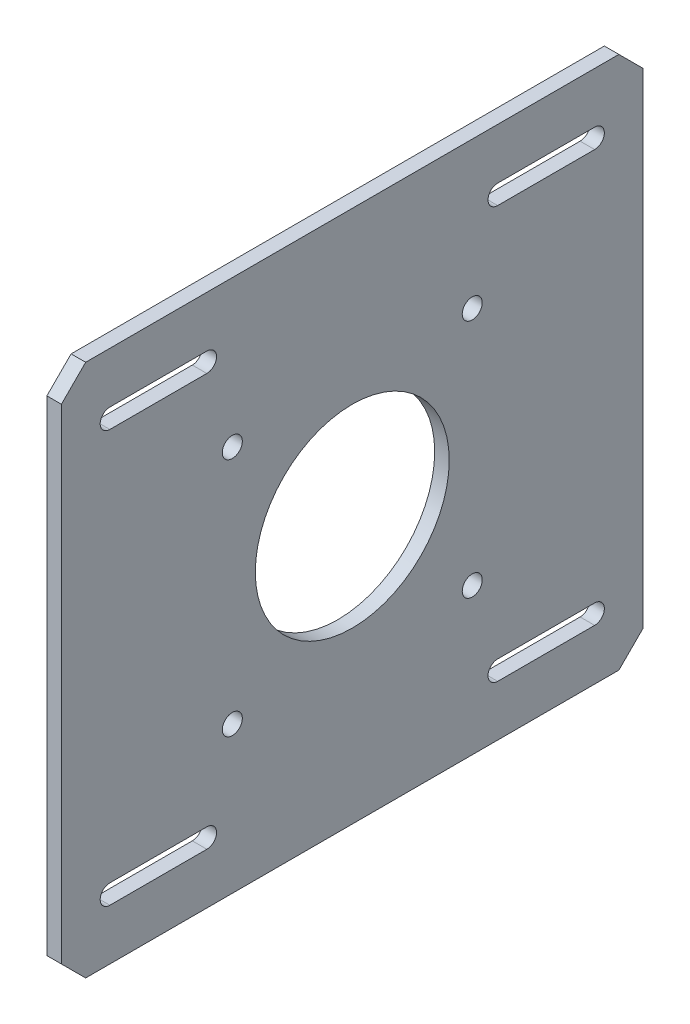
ISO-10303-21;
HEADER;
FILE_DESCRIPTION(('STEP AP214'),'2;1');
FILE_NAME('part.step','',(''),(''),'','','');
FILE_SCHEMA(('AUTOMOTIVE_DESIGN { 1 0 10303 214 1 1 1 1 }'));
ENDSEC;
DATA;
#1=APPLICATION_CONTEXT('core data for automotive mechanical design processes');
#2=APPLICATION_PROTOCOL_DEFINITION('international standard','automotive_design',2000,#1);
#3=PRODUCT_CONTEXT('',#1,'mechanical');
#4=PRODUCT('Part','Part','',(#3));
#5=PRODUCT_RELATED_PRODUCT_CATEGORY('part','',(#4));
#6=PRODUCT_DEFINITION_FORMATION('','',#4);
#7=PRODUCT_DEFINITION_CONTEXT('part definition',#1,'design');
#8=PRODUCT_DEFINITION('design','',#6,#7);
#9=PRODUCT_DEFINITION_SHAPE('','',#8);
#10=(LENGTH_UNIT() NAMED_UNIT(*) SI_UNIT(.MILLI.,.METRE.));
#11=(NAMED_UNIT(*) PLANE_ANGLE_UNIT() SI_UNIT($,.RADIAN.));
#12=(NAMED_UNIT(*) SI_UNIT($,.STERADIAN.) SOLID_ANGLE_UNIT());
#13=UNCERTAINTY_MEASURE_WITH_UNIT(LENGTH_MEASURE(1.E-05),#10,'distance_accuracy_value','');
#14=(GEOMETRIC_REPRESENTATION_CONTEXT(3) GLOBAL_UNCERTAINTY_ASSIGNED_CONTEXT((#13)) GLOBAL_UNIT_ASSIGNED_CONTEXT((#10,
#11,#12)) REPRESENTATION_CONTEXT('',''));
#15=CARTESIAN_POINT('',(0.,0.,0.));
#16=DIRECTION('',(0.,0.,1.));
#17=DIRECTION('',(1.,0.,0.));
#18=AXIS2_PLACEMENT_3D('',#15,#16,#17);
#19=CARTESIAN_POINT('',(3.,0.,0.));
#20=DIRECTION('',(1.,0.,0.));
#21=DIRECTION('',(0.,1.,0.));
#22=AXIS2_PLACEMENT_3D('',#19,#20,#21);
#23=PLANE('',#22);
#24=DIRECTION('',(0.,0.,1.));
#25=VECTOR('',#24,1.);
#26=CARTESIAN_POINT('',(3.,40.5,15.));
#27=LINE('',#26,#25);
#28=CARTESIAN_POINT('',(3.,40.5,30.));
#29=VERTEX_POINT('',#28);
#30=CARTESIAN_POINT('',(3.,40.5,50.));
#31=VERTEX_POINT('',#30);
#32=EDGE_CURVE('E328',#29,#31,#27,.T.);
#33=ORIENTED_EDGE('',*,*,#32,.T.);
#34=CARTESIAN_POINT('',(3.,42.5,50.));
#35=DIRECTION('',(-1.,0.,0.));
#36=DIRECTION('',(0.,1.,0.));
#37=AXIS2_PLACEMENT_3D('',#34,#35,#36);
#38=CIRCLE('',#37,2.);
#39=CARTESIAN_POINT('',(3.,44.5,50.));
#40=VERTEX_POINT('',#39);
#41=EDGE_CURVE('E358',#31,#40,#38,.T.);
#42=ORIENTED_EDGE('',*,*,#41,.T.);
#43=DIRECTION('',(0.,0.,-1.));
#44=VECTOR('',#43,1.);
#45=CARTESIAN_POINT('',(3.,44.5,25.));
#46=LINE('',#45,#44);
#47=CARTESIAN_POINT('',(3.,44.5,30.));
#48=VERTEX_POINT('',#47);
#49=EDGE_CURVE('E321',#40,#48,#46,.T.);
#50=ORIENTED_EDGE('',*,*,#49,.T.);
#51=CARTESIAN_POINT('',(3.,42.5,30.));
#52=DIRECTION('',(-1.,0.,0.));
#53=DIRECTION('',(0.,-1.,0.));
#54=AXIS2_PLACEMENT_3D('',#51,#52,#53);
#55=CIRCLE('',#54,2.);
#56=EDGE_CURVE('E28',#48,#29,#55,.T.);
#57=ORIENTED_EDGE('',*,*,#56,.T.);
#58=EDGE_LOOP('',(#33,#42,#50,#57));
#59=FACE_BOUND('',#58,.T.);
#60=DIRECTION('',(0.,0.,1.));
#61=VECTOR('',#60,1.);
#62=CARTESIAN_POINT('',(3.,-44.5,15.));
#63=LINE('',#62,#61);
#64=CARTESIAN_POINT('',(3.,-44.5,30.));
#65=VERTEX_POINT('',#64);
#66=CARTESIAN_POINT('',(3.,-44.5,50.));
#67=VERTEX_POINT('',#66);
#68=EDGE_CURVE('E423',#65,#67,#63,.T.);
#69=ORIENTED_EDGE('',*,*,#68,.T.);
#70=CARTESIAN_POINT('',(3.,-42.5,50.));
#71=DIRECTION('',(-1.,0.,0.));
#72=DIRECTION('',(0.,1.,0.));
#73=AXIS2_PLACEMENT_3D('',#70,#71,#72);
#74=CIRCLE('',#73,2.);
#75=CARTESIAN_POINT('',(3.,-40.5,50.));
#76=VERTEX_POINT('',#75);
#77=EDGE_CURVE('E424',#67,#76,#74,.T.);
#78=ORIENTED_EDGE('',*,*,#77,.T.);
#79=DIRECTION('',(0.,0.,-1.));
#80=VECTOR('',#79,1.);
#81=CARTESIAN_POINT('',(3.,-40.5,25.));
#82=LINE('',#81,#80);
#83=CARTESIAN_POINT('',(3.,-40.5,30.));
#84=VERTEX_POINT('',#83);
#85=EDGE_CURVE('E469',#76,#84,#82,.T.);
#86=ORIENTED_EDGE('',*,*,#85,.T.);
#87=CARTESIAN_POINT('',(3.,-42.5,30.));
#88=DIRECTION('',(-1.,0.,0.));
#89=DIRECTION('',(0.,-1.,0.));
#90=AXIS2_PLACEMENT_3D('',#87,#88,#89);
#91=CIRCLE('',#90,2.);
#92=EDGE_CURVE('E340',#84,#65,#91,.T.);
#93=ORIENTED_EDGE('',*,*,#92,.T.);
#94=EDGE_LOOP('',(#69,#78,#86,#93));
#95=FACE_BOUND('',#94,.T.);
#96=DIRECTION('',(0.,0.,1.));
#97=VECTOR('',#96,1.);
#98=CARTESIAN_POINT('',(3.,40.5,-25.));
#99=LINE('',#98,#97);
#100=CARTESIAN_POINT('',(3.,40.5,-50.));
#101=VERTEX_POINT('',#100);
#102=CARTESIAN_POINT('',(3.,40.5,-30.));
#103=VERTEX_POINT('',#102);
#104=EDGE_CURVE('E335',#101,#103,#99,.T.);
#105=ORIENTED_EDGE('',*,*,#104,.T.);
#106=CARTESIAN_POINT('',(3.,42.5,-30.));
#107=DIRECTION('',(-1.,0.,0.));
#108=DIRECTION('',(0.,1.,0.));
#109=AXIS2_PLACEMENT_3D('',#106,#107,#108);
#110=CIRCLE('',#109,2.);
#111=CARTESIAN_POINT('',(3.,44.5,-30.));
#112=VERTEX_POINT('',#111);
#113=EDGE_CURVE('E371',#103,#112,#110,.T.);
#114=ORIENTED_EDGE('',*,*,#113,.T.);
#115=DIRECTION('',(0.,0.,-1.));
#116=VECTOR('',#115,1.);
#117=CARTESIAN_POINT('',(3.,44.5,-15.));
#118=LINE('',#117,#116);
#119=CARTESIAN_POINT('',(3.,44.5,-50.));
#120=VERTEX_POINT('',#119);
#121=EDGE_CURVE('E21',#112,#120,#118,.T.);
#122=ORIENTED_EDGE('',*,*,#121,.T.);
#123=CARTESIAN_POINT('',(3.,42.5,-50.));
#124=DIRECTION('',(-1.,0.,0.));
#125=DIRECTION('',(0.,-1.,0.));
#126=AXIS2_PLACEMENT_3D('',#123,#124,#125);
#127=CIRCLE('',#126,2.);
#128=EDGE_CURVE('E373',#120,#101,#127,.T.);
#129=ORIENTED_EDGE('',*,*,#128,.T.);
#130=EDGE_LOOP('',(#105,#114,#122,#129));
#131=FACE_BOUND('',#130,.T.);
#132=DIRECTION('',(0.,0.,1.));
#133=VECTOR('',#132,1.);
#134=CARTESIAN_POINT('',(3.,-44.5,-25.));
#135=LINE('',#134,#133);
#136=CARTESIAN_POINT('',(3.,-44.5,-50.));
#137=VERTEX_POINT('',#136);
#138=CARTESIAN_POINT('',(3.,-44.5,-30.));
#139=VERTEX_POINT('',#138);
#140=EDGE_CURVE('E261',#137,#139,#135,.T.);
#141=ORIENTED_EDGE('',*,*,#140,.T.);
#142=CARTESIAN_POINT('',(3.,-42.5,-30.));
#143=DIRECTION('',(-1.,0.,0.));
#144=DIRECTION('',(0.,1.,0.));
#145=AXIS2_PLACEMENT_3D('',#142,#143,#144);
#146=CIRCLE('',#145,2.);
#147=CARTESIAN_POINT('',(3.,-40.5,-30.));
#148=VERTEX_POINT('',#147);
#149=EDGE_CURVE('E289',#139,#148,#146,.T.);
#150=ORIENTED_EDGE('',*,*,#149,.T.);
#151=DIRECTION('',(0.,0.,-1.));
#152=VECTOR('',#151,1.);
#153=CARTESIAN_POINT('',(3.,-40.5,-15.));
#154=LINE('',#153,#152);
#155=CARTESIAN_POINT('',(3.,-40.5,-50.));
#156=VERTEX_POINT('',#155);
#157=EDGE_CURVE('E264',#148,#156,#154,.T.);
#158=ORIENTED_EDGE('',*,*,#157,.T.);
#159=CARTESIAN_POINT('',(3.,-42.5,-50.));
#160=DIRECTION('',(-1.,0.,0.));
#161=DIRECTION('',(0.,-1.,0.));
#162=AXIS2_PLACEMENT_3D('',#159,#160,#161);
#163=CIRCLE('',#162,2.);
#164=EDGE_CURVE('E257',#156,#137,#163,.T.);
#165=ORIENTED_EDGE('',*,*,#164,.T.);
#166=EDGE_LOOP('',(#141,#150,#158,#165));
#167=FACE_BOUND('',#166,.T.);
#168=CARTESIAN_POINT('',(3.,0.,0.));
#169=DIRECTION('',(-1.,0.,0.));
#170=DIRECTION('',(0.,0.,-1.));
#171=AXIS2_PLACEMENT_3D('',#168,#169,#170);
#172=CIRCLE('',#171,20.);
#173=CARTESIAN_POINT('',(3.,0.,20.));
#174=VERTEX_POINT('',#173);
#175=EDGE_CURVE('E347',#174,#174,#172,.T.);
#176=ORIENTED_EDGE('',*,*,#175,.T.);
#177=EDGE_LOOP('',(#176));
#178=FACE_BOUND('',#177,.T.);
#179=CARTESIAN_POINT('',(3.,24.7487373415292,-24.7487373415292));
#180=DIRECTION('',(-1.,0.,0.));
#181=DIRECTION('',(0.,0.,-1.));
#182=AXIS2_PLACEMENT_3D('',#179,#180,#181);
#183=CIRCLE('',#182,2.067);
#184=CARTESIAN_POINT('',(3.,24.7487373415292,-22.6817373415292));
#185=VERTEX_POINT('',#184);
#186=EDGE_CURVE('E387',#185,#185,#183,.T.);
#187=ORIENTED_EDGE('',*,*,#186,.T.);
#188=EDGE_LOOP('',(#187));
#189=FACE_BOUND('',#188,.T.);
#190=CARTESIAN_POINT('',(3.,-24.7487373415292,24.7487373415292));
#191=DIRECTION('',(-1.,0.,0.));
#192=DIRECTION('',(0.,0.,-1.));
#193=AXIS2_PLACEMENT_3D('',#190,#191,#192);
#194=CIRCLE('',#193,2.067);
#195=CARTESIAN_POINT('',(3.,-24.7487373415292,26.8157373415292));
#196=VERTEX_POINT('',#195);
#197=EDGE_CURVE('E308',#196,#196,#194,.T.);
#198=ORIENTED_EDGE('',*,*,#197,.T.);
#199=EDGE_LOOP('',(#198));
#200=FACE_BOUND('',#199,.T.);
#201=CARTESIAN_POINT('',(3.,24.7487373415292,24.7487373415292));
#202=DIRECTION('',(-1.,0.,0.));
#203=DIRECTION('',(0.,0.,-1.));
#204=AXIS2_PLACEMENT_3D('',#201,#202,#203);
#205=CIRCLE('',#204,2.067);
#206=CARTESIAN_POINT('',(3.,24.7487373415292,26.8157373415292));
#207=VERTEX_POINT('',#206);
#208=EDGE_CURVE('E305',#207,#207,#205,.T.);
#209=ORIENTED_EDGE('',*,*,#208,.T.);
#210=EDGE_LOOP('',(#209));
#211=FACE_BOUND('',#210,.T.);
#212=CARTESIAN_POINT('',(3.,-24.7487373415292,-24.7487373415292));
#213=DIRECTION('',(-1.,0.,0.));
#214=DIRECTION('',(0.,0.,-1.));
#215=AXIS2_PLACEMENT_3D('',#212,#213,#214);
#216=CIRCLE('',#215,2.067);
#217=CARTESIAN_POINT('',(3.,-24.7487373415292,-22.6817373415292));
#218=VERTEX_POINT('',#217);
#219=EDGE_CURVE('E433',#218,#218,#216,.T.);
#220=ORIENTED_EDGE('',*,*,#219,.T.);
#221=EDGE_LOOP('',(#220));
#222=FACE_BOUND('',#221,.T.);
#223=DIRECTION('',(0.,-0.707106781186548,0.707106781186548));
#224=VECTOR('',#223,1.);
#225=CARTESIAN_POINT('',(3.,-53.75,-56.25));
#226=LINE('',#225,#224);
#227=CARTESIAN_POINT('',(3.,-50.,-60.));
#228=VERTEX_POINT('',#227);
#229=CARTESIAN_POINT('',(3.,-55.,-55.));
#230=VERTEX_POINT('',#229);
#231=EDGE_CURVE('E411',#228,#230,#226,.T.);
#232=ORIENTED_EDGE('',*,*,#231,.F.);
#233=DIRECTION('',(0.,1.,0.));
#234=VECTOR('',#233,1.);
#235=CARTESIAN_POINT('',(3.,-55.,-60.));
#236=LINE('',#235,#234);
#237=CARTESIAN_POINT('',(3.,50.,-60.));
#238=VERTEX_POINT('',#237);
#239=EDGE_CURVE('E467',#228,#238,#236,.T.);
#240=ORIENTED_EDGE('',*,*,#239,.T.);
#241=DIRECTION('',(0.,-0.707106781186548,-0.707106781186548));
#242=VECTOR('',#241,1.);
#243=CARTESIAN_POINT('',(3.,53.75,-56.25));
#244=LINE('',#243,#242);
#245=CARTESIAN_POINT('',(3.,55.,-55.));
#246=VERTEX_POINT('',#245);
#247=EDGE_CURVE('E514',#246,#238,#244,.T.);
#248=ORIENTED_EDGE('',*,*,#247,.F.);
#249=DIRECTION('',(0.,0.,1.));
#250=VECTOR('',#249,1.);
#251=CARTESIAN_POINT('',(3.,55.,-60.));
#252=LINE('',#251,#250);
#253=CARTESIAN_POINT('',(3.,55.,55.));
#254=VERTEX_POINT('',#253);
#255=EDGE_CURVE('E353',#246,#254,#252,.T.);
#256=ORIENTED_EDGE('',*,*,#255,.T.);
#257=DIRECTION('',(0.,0.707106781186548,-0.707106781186548));
#258=VECTOR('',#257,1.);
#259=CARTESIAN_POINT('',(3.,53.75,56.25));
#260=LINE('',#259,#258);
#261=CARTESIAN_POINT('',(3.,50.,60.));
#262=VERTEX_POINT('',#261);
#263=EDGE_CURVE('E461',#262,#254,#260,.T.);
#264=ORIENTED_EDGE('',*,*,#263,.F.);
#265=DIRECTION('',(0.,-1.,0.));
#266=VECTOR('',#265,1.);
#267=CARTESIAN_POINT('',(3.,55.,60.));
#268=LINE('',#267,#266);
#269=CARTESIAN_POINT('',(3.,-50.,60.));
#270=VERTEX_POINT('',#269);
#271=EDGE_CURVE('E11',#262,#270,#268,.T.);
#272=ORIENTED_EDGE('',*,*,#271,.T.);
#273=DIRECTION('',(0.,0.707106781186548,0.707106781186548));
#274=VECTOR('',#273,1.);
#275=CARTESIAN_POINT('',(3.,-53.75,56.25));
#276=LINE('',#275,#274);
#277=CARTESIAN_POINT('',(3.,-55.,55.));
#278=VERTEX_POINT('',#277);
#279=EDGE_CURVE('E349',#278,#270,#276,.T.);
#280=ORIENTED_EDGE('',*,*,#279,.F.);
#281=DIRECTION('',(0.,0.,-1.));
#282=VECTOR('',#281,1.);
#283=CARTESIAN_POINT('',(3.,-55.,60.));
#284=LINE('',#283,#282);
#285=EDGE_CURVE('E298',#278,#230,#284,.T.);
#286=ORIENTED_EDGE('',*,*,#285,.T.);
#287=EDGE_LOOP('',(#232,#240,#248,#256,#264,#272,#280,#286));
#288=FACE_BOUND('',#287,.T.);
#289=ADVANCED_FACE('F17',(#59,#95,#131,#167,#178,#189,#200,#211,#222,#288),#23,.T.);
#290=CARTESIAN_POINT('',(0.,55.,60.));
#291=DIRECTION('',(0.,0.,1.));
#292=DIRECTION('',(1.,0.,0.));
#293=AXIS2_PLACEMENT_3D('',#290,#291,#292);
#294=PLANE('',#293);
#295=DIRECTION('',(-1.,0.,0.));
#296=VECTOR('',#295,1.);
#297=CARTESIAN_POINT('',(0.,-50.,60.));
#298=LINE('',#297,#296);
#299=CARTESIAN_POINT('',(0.,-50.,60.));
#300=VERTEX_POINT('',#299);
#301=EDGE_CURVE('E299',#270,#300,#298,.T.);
#302=ORIENTED_EDGE('',*,*,#301,.F.);
#303=ORIENTED_EDGE('',*,*,#271,.F.);
#304=DIRECTION('',(1.,0.,0.));
#305=VECTOR('',#304,1.);
#306=CARTESIAN_POINT('',(0.,50.,60.));
#307=LINE('',#306,#305);
#308=CARTESIAN_POINT('',(0.,50.,60.));
#309=VERTEX_POINT('',#308);
#310=EDGE_CURVE('E551',#309,#262,#307,.T.);
#311=ORIENTED_EDGE('',*,*,#310,.F.);
#312=DIRECTION('',(0.,-1.,0.));
#313=VECTOR('',#312,1.);
#314=CARTESIAN_POINT('',(0.,55.,60.));
#315=LINE('',#314,#313);
#316=EDGE_CURVE('E309',#309,#300,#315,.T.);
#317=ORIENTED_EDGE('',*,*,#316,.T.);
#318=EDGE_LOOP('',(#302,#303,#311,#317));
#319=FACE_BOUND('',#318,.T.);
#320=ADVANCED_FACE('F590',(#319),#294,.T.);
#321=CARTESIAN_POINT('',(3.,42.5,30.));
#322=DIRECTION('',(-1.,0.,0.));
#323=DIRECTION('',(0.,-1.,0.));
#324=AXIS2_PLACEMENT_3D('',#321,#322,#323);
#325=CYLINDRICAL_SURFACE('',#324,2.);
#326=CARTESIAN_POINT('',(0.,42.5,30.));
#327=DIRECTION('',(1.,0.,0.));
#328=DIRECTION('',(0.,-1.,0.));
#329=AXIS2_PLACEMENT_3D('',#326,#327,#328);
#330=CIRCLE('',#329,2.);
#331=CARTESIAN_POINT('',(0.,40.5,30.));
#332=VERTEX_POINT('',#331);
#333=CARTESIAN_POINT('',(0.,44.5,30.));
#334=VERTEX_POINT('',#333);
#335=EDGE_CURVE('E388',#332,#334,#330,.T.);
#336=ORIENTED_EDGE('',*,*,#335,.F.);
#337=DIRECTION('',(-1.,0.,0.));
#338=VECTOR('',#337,1.);
#339=CARTESIAN_POINT('',(3.,40.5,30.));
#340=LINE('',#339,#338);
#341=EDGE_CURVE('E325',#29,#332,#340,.T.);
#342=ORIENTED_EDGE('',*,*,#341,.F.);
#343=ORIENTED_EDGE('',*,*,#56,.F.);
#344=DIRECTION('',(-1.,0.,0.));
#345=VECTOR('',#344,1.);
#346=CARTESIAN_POINT('',(3.,44.5,30.));
#347=LINE('',#346,#345);
#348=EDGE_CURVE('E293',#48,#334,#347,.T.);
#349=ORIENTED_EDGE('',*,*,#348,.T.);
#350=EDGE_LOOP('',(#336,#342,#343,#349));
#351=FACE_BOUND('',#350,.T.);
#352=ADVANCED_FACE('F695',(#351),#325,.F.);
#353=CARTESIAN_POINT('',(3.,40.5,30.));
#354=DIRECTION('',(0.,-1.,0.));
#355=DIRECTION('',(0.,0.,-1.));
#356=AXIS2_PLACEMENT_3D('',#353,#354,#355);
#357=PLANE('',#356);
#358=DIRECTION('',(0.,0.,-1.));
#359=VECTOR('',#358,1.);
#360=CARTESIAN_POINT('',(0.,40.5,15.));
#361=LINE('',#360,#359);
#362=CARTESIAN_POINT('',(0.,40.5,50.));
#363=VERTEX_POINT('',#362);
#364=EDGE_CURVE('E319',#363,#332,#361,.T.);
#365=ORIENTED_EDGE('',*,*,#364,.F.);
#366=DIRECTION('',(-1.,0.,0.));
#367=VECTOR('',#366,1.);
#368=CARTESIAN_POINT('',(3.,40.5,50.));
#369=LINE('',#368,#367);
#370=EDGE_CURVE('E361',#31,#363,#369,.T.);
#371=ORIENTED_EDGE('',*,*,#370,.F.);
#372=ORIENTED_EDGE('',*,*,#32,.F.);
#373=ORIENTED_EDGE('',*,*,#341,.T.);
#374=EDGE_LOOP('',(#365,#371,#372,#373));
#375=FACE_BOUND('',#374,.T.);
#376=ADVANCED_FACE('F683',(#375),#357,.F.);
#377=CARTESIAN_POINT('',(3.,42.5,50.));
#378=DIRECTION('',(-1.,0.,0.));
#379=DIRECTION('',(0.,1.,0.));
#380=AXIS2_PLACEMENT_3D('',#377,#378,#379);
#381=CYLINDRICAL_SURFACE('',#380,2.);
#382=CARTESIAN_POINT('',(0.,42.5,50.));
#383=DIRECTION('',(1.,0.,0.));
#384=DIRECTION('',(0.,1.,0.));
#385=AXIS2_PLACEMENT_3D('',#382,#383,#384);
#386=CIRCLE('',#385,2.);
#387=CARTESIAN_POINT('',(0.,44.5,50.));
#388=VERTEX_POINT('',#387);
#389=EDGE_CURVE('E510',#388,#363,#386,.T.);
#390=ORIENTED_EDGE('',*,*,#389,.F.);
#391=DIRECTION('',(-1.,0.,0.));
#392=VECTOR('',#391,1.);
#393=CARTESIAN_POINT('',(3.,44.5,50.));
#394=LINE('',#393,#392);
#395=EDGE_CURVE('E324',#40,#388,#394,.T.);
#396=ORIENTED_EDGE('',*,*,#395,.F.);
#397=ORIENTED_EDGE('',*,*,#41,.F.);
#398=ORIENTED_EDGE('',*,*,#370,.T.);
#399=EDGE_LOOP('',(#390,#396,#397,#398));
#400=FACE_BOUND('',#399,.T.);
#401=ADVANCED_FACE('F674',(#400),#381,.F.);
#402=CARTESIAN_POINT('',(3.,44.5,50.));
#403=DIRECTION('',(0.,1.,0.));
#404=DIRECTION('',(1.,0.,0.));
#405=AXIS2_PLACEMENT_3D('',#402,#403,#404);
#406=PLANE('',#405);
#407=DIRECTION('',(0.,0.,1.));
#408=VECTOR('',#407,1.);
#409=CARTESIAN_POINT('',(0.,44.5,25.));
#410=LINE('',#409,#408);
#411=EDGE_CURVE('E392',#334,#388,#410,.T.);
#412=ORIENTED_EDGE('',*,*,#411,.F.);
#413=ORIENTED_EDGE('',*,*,#348,.F.);
#414=ORIENTED_EDGE('',*,*,#49,.F.);
#415=ORIENTED_EDGE('',*,*,#395,.T.);
#416=EDGE_LOOP('',(#412,#413,#414,#415));
#417=FACE_BOUND('',#416,.T.);
#418=ADVANCED_FACE('F671',(#417),#406,.F.);
#419=CARTESIAN_POINT('',(3.,-42.5,30.));
#420=DIRECTION('',(-1.,0.,0.));
#421=DIRECTION('',(0.,-1.,0.));
#422=AXIS2_PLACEMENT_3D('',#419,#420,#421);
#423=CYLINDRICAL_SURFACE('',#422,2.);
#424=CARTESIAN_POINT('',(0.,-42.5,30.));
#425=DIRECTION('',(1.,0.,0.));
#426=DIRECTION('',(0.,-1.,0.));
#427=AXIS2_PLACEMENT_3D('',#424,#425,#426);
#428=CIRCLE('',#427,2.);
#429=CARTESIAN_POINT('',(0.,-44.5,30.));
#430=VERTEX_POINT('',#429);
#431=CARTESIAN_POINT('',(0.,-40.5,30.));
#432=VERTEX_POINT('',#431);
#433=EDGE_CURVE('E333',#430,#432,#428,.T.);
#434=ORIENTED_EDGE('',*,*,#433,.F.);
#435=DIRECTION('',(-1.,0.,0.));
#436=VECTOR('',#435,1.);
#437=CARTESIAN_POINT('',(3.,-44.5,30.));
#438=LINE('',#437,#436);
#439=EDGE_CURVE('E343',#65,#430,#438,.T.);
#440=ORIENTED_EDGE('',*,*,#439,.F.);
#441=ORIENTED_EDGE('',*,*,#92,.F.);
#442=DIRECTION('',(-1.,0.,0.));
#443=VECTOR('',#442,1.);
#444=CARTESIAN_POINT('',(3.,-40.5,30.));
#445=LINE('',#444,#443);
#446=EDGE_CURVE('E376',#84,#432,#445,.T.);
#447=ORIENTED_EDGE('',*,*,#446,.T.);
#448=EDGE_LOOP('',(#434,#440,#441,#447));
#449=FACE_BOUND('',#448,.T.);
#450=ADVANCED_FACE('F673',(#449),#423,.F.);
#451=CARTESIAN_POINT('',(3.,-44.5,30.));
#452=DIRECTION('',(0.,-1.,0.));
#453=DIRECTION('',(0.,0.,-1.));
#454=AXIS2_PLACEMENT_3D('',#451,#452,#453);
#455=PLANE('',#454);
#456=DIRECTION('',(0.,0.,-1.));
#457=VECTOR('',#456,1.);
#458=CARTESIAN_POINT('',(0.,-44.5,15.));
#459=LINE('',#458,#457);
#460=CARTESIAN_POINT('',(0.,-44.5,50.));
#461=VERTEX_POINT('',#460);
#462=EDGE_CURVE('E329',#461,#430,#459,.T.);
#463=ORIENTED_EDGE('',*,*,#462,.F.);
#464=DIRECTION('',(-1.,0.,0.));
#465=VECTOR('',#464,1.);
#466=CARTESIAN_POINT('',(3.,-44.5,50.));
#467=LINE('',#466,#465);
#468=EDGE_CURVE('E420',#67,#461,#467,.T.);
#469=ORIENTED_EDGE('',*,*,#468,.F.);
#470=ORIENTED_EDGE('',*,*,#68,.F.);
#471=ORIENTED_EDGE('',*,*,#439,.T.);
#472=EDGE_LOOP('',(#463,#469,#470,#471));
#473=FACE_BOUND('',#472,.T.);
#474=ADVANCED_FACE('F680',(#473),#455,.F.);
#475=CARTESIAN_POINT('',(3.,-42.5,50.));
#476=DIRECTION('',(-1.,0.,0.));
#477=DIRECTION('',(0.,1.,0.));
#478=AXIS2_PLACEMENT_3D('',#475,#476,#477);
#479=CYLINDRICAL_SURFACE('',#478,2.);
#480=CARTESIAN_POINT('',(0.,-42.5,50.));
#481=DIRECTION('',(1.,0.,0.));
#482=DIRECTION('',(0.,1.,0.));
#483=AXIS2_PLACEMENT_3D('',#480,#481,#482);
#484=CIRCLE('',#483,2.);
#485=CARTESIAN_POINT('',(0.,-40.5,50.));
#486=VERTEX_POINT('',#485);
#487=EDGE_CURVE('E315',#486,#461,#484,.T.);
#488=ORIENTED_EDGE('',*,*,#487,.F.);
#489=DIRECTION('',(-1.,0.,0.));
#490=VECTOR('',#489,1.);
#491=CARTESIAN_POINT('',(3.,-40.5,50.));
#492=LINE('',#491,#490);
#493=EDGE_CURVE('E471',#76,#486,#492,.T.);
#494=ORIENTED_EDGE('',*,*,#493,.F.);
#495=ORIENTED_EDGE('',*,*,#77,.F.);
#496=ORIENTED_EDGE('',*,*,#468,.T.);
#497=EDGE_LOOP('',(#488,#494,#495,#496));
#498=FACE_BOUND('',#497,.T.);
#499=ADVANCED_FACE('F716',(#498),#479,.F.);
#500=CARTESIAN_POINT('',(3.,-40.5,50.));
#501=DIRECTION('',(0.,1.,0.));
#502=DIRECTION('',(1.,0.,0.));
#503=AXIS2_PLACEMENT_3D('',#500,#501,#502);
#504=PLANE('',#503);
#505=DIRECTION('',(0.,0.,1.));
#506=VECTOR('',#505,1.);
#507=CARTESIAN_POINT('',(0.,-40.5,25.));
#508=LINE('',#507,#506);
#509=EDGE_CURVE('E320',#432,#486,#508,.T.);
#510=ORIENTED_EDGE('',*,*,#509,.F.);
#511=ORIENTED_EDGE('',*,*,#446,.F.);
#512=ORIENTED_EDGE('',*,*,#85,.F.);
#513=ORIENTED_EDGE('',*,*,#493,.T.);
#514=EDGE_LOOP('',(#510,#511,#512,#513));
#515=FACE_BOUND('',#514,.T.);
#516=ADVANCED_FACE('F713',(#515),#504,.F.);
#517=CARTESIAN_POINT('',(3.,42.5,-50.));
#518=DIRECTION('',(-1.,0.,0.));
#519=DIRECTION('',(0.,-1.,0.));
#520=AXIS2_PLACEMENT_3D('',#517,#518,#519);
#521=CYLINDRICAL_SURFACE('',#520,2.);
#522=CARTESIAN_POINT('',(0.,42.5,-50.));
#523=DIRECTION('',(1.,0.,0.));
#524=DIRECTION('',(0.,-1.,0.));
#525=AXIS2_PLACEMENT_3D('',#522,#523,#524);
#526=CIRCLE('',#525,2.);
#527=CARTESIAN_POINT('',(0.,40.5,-50.));
#528=VERTEX_POINT('',#527);
#529=CARTESIAN_POINT('',(0.,44.5,-50.));
#530=VERTEX_POINT('',#529);
#531=EDGE_CURVE('E419',#528,#530,#526,.T.);
#532=ORIENTED_EDGE('',*,*,#531,.F.);
#533=DIRECTION('',(-1.,0.,0.));
#534=VECTOR('',#533,1.);
#535=CARTESIAN_POINT('',(3.,40.5,-50.));
#536=LINE('',#535,#534);
#537=EDGE_CURVE('E338',#101,#528,#536,.T.);
#538=ORIENTED_EDGE('',*,*,#537,.F.);
#539=ORIENTED_EDGE('',*,*,#128,.F.);
#540=DIRECTION('',(-1.,0.,0.));
#541=VECTOR('',#540,1.);
#542=CARTESIAN_POINT('',(3.,44.5,-50.));
#543=LINE('',#542,#541);
#544=EDGE_CURVE('E268',#120,#530,#543,.T.);
#545=ORIENTED_EDGE('',*,*,#544,.T.);
#546=EDGE_LOOP('',(#532,#538,#539,#545));
#547=FACE_BOUND('',#546,.T.);
#548=ADVANCED_FACE('F669',(#547),#521,.F.);
#549=CARTESIAN_POINT('',(3.,40.5,-50.));
#550=DIRECTION('',(0.,-1.,0.));
#551=DIRECTION('',(0.,0.,-1.));
#552=AXIS2_PLACEMENT_3D('',#549,#550,#551);
#553=PLANE('',#552);
#554=DIRECTION('',(0.,0.,-1.));
#555=VECTOR('',#554,1.);
#556=CARTESIAN_POINT('',(0.,40.5,-25.));
#557=LINE('',#556,#555);
#558=CARTESIAN_POINT('',(0.,40.5,-30.));
#559=VERTEX_POINT('',#558);
#560=EDGE_CURVE('E503',#559,#528,#557,.T.);
#561=ORIENTED_EDGE('',*,*,#560,.F.);
#562=DIRECTION('',(-1.,0.,0.));
#563=VECTOR('',#562,1.);
#564=CARTESIAN_POINT('',(3.,40.5,-30.));
#565=LINE('',#564,#563);
#566=EDGE_CURVE('E339',#103,#559,#565,.T.);
#567=ORIENTED_EDGE('',*,*,#566,.F.);
#568=ORIENTED_EDGE('',*,*,#104,.F.);
#569=ORIENTED_EDGE('',*,*,#537,.T.);
#570=EDGE_LOOP('',(#561,#567,#568,#569));
#571=FACE_BOUND('',#570,.T.);
#572=ADVANCED_FACE('F666',(#571),#553,.F.);
#573=CARTESIAN_POINT('',(3.,42.5,-30.));
#574=DIRECTION('',(-1.,0.,0.));
#575=DIRECTION('',(0.,1.,0.));
#576=AXIS2_PLACEMENT_3D('',#573,#574,#575);
#577=CYLINDRICAL_SURFACE('',#576,2.);
#578=CARTESIAN_POINT('',(0.,42.5,-30.));
#579=DIRECTION('',(1.,0.,0.));
#580=DIRECTION('',(0.,1.,0.));
#581=AXIS2_PLACEMENT_3D('',#578,#579,#580);
#582=CIRCLE('',#581,2.);
#583=CARTESIAN_POINT('',(0.,44.5,-30.));
#584=VERTEX_POINT('',#583);
#585=EDGE_CURVE('E334',#584,#559,#582,.T.);
#586=ORIENTED_EDGE('',*,*,#585,.F.);
#587=DIRECTION('',(-1.,0.,0.));
#588=VECTOR('',#587,1.);
#589=CARTESIAN_POINT('',(3.,44.5,-30.));
#590=LINE('',#589,#588);
#591=EDGE_CURVE('E369',#112,#584,#590,.T.);
#592=ORIENTED_EDGE('',*,*,#591,.F.);
#593=ORIENTED_EDGE('',*,*,#113,.F.);
#594=ORIENTED_EDGE('',*,*,#566,.T.);
#595=EDGE_LOOP('',(#586,#592,#593,#594));
#596=FACE_BOUND('',#595,.T.);
#597=ADVANCED_FACE('F668',(#596),#577,.F.);
#598=CARTESIAN_POINT('',(3.,44.5,-30.));
#599=DIRECTION('',(0.,1.,0.));
#600=DIRECTION('',(1.,0.,0.));
#601=AXIS2_PLACEMENT_3D('',#598,#599,#600);
#602=PLANE('',#601);
#603=DIRECTION('',(0.,0.,1.));
#604=VECTOR('',#603,1.);
#605=CARTESIAN_POINT('',(0.,44.5,-15.));
#606=LINE('',#605,#604);
#607=EDGE_CURVE('E384',#530,#584,#606,.T.);
#608=ORIENTED_EDGE('',*,*,#607,.F.);
#609=ORIENTED_EDGE('',*,*,#544,.F.);
#610=ORIENTED_EDGE('',*,*,#121,.F.);
#611=ORIENTED_EDGE('',*,*,#591,.T.);
#612=EDGE_LOOP('',(#608,#609,#610,#611));
#613=FACE_BOUND('',#612,.T.);
#614=ADVANCED_FACE('F719',(#613),#602,.F.);
#615=CARTESIAN_POINT('',(3.,-42.5,-50.));
#616=DIRECTION('',(-1.,0.,0.));
#617=DIRECTION('',(0.,-1.,0.));
#618=AXIS2_PLACEMENT_3D('',#615,#616,#617);
#619=CYLINDRICAL_SURFACE('',#618,2.);
#620=CARTESIAN_POINT('',(0.,-42.5,-50.));
#621=DIRECTION('',(1.,0.,0.));
#622=DIRECTION('',(0.,-1.,0.));
#623=AXIS2_PLACEMENT_3D('',#620,#621,#622);
#624=CIRCLE('',#623,2.);
#625=CARTESIAN_POINT('',(0.,-44.5,-50.));
#626=VERTEX_POINT('',#625);
#627=CARTESIAN_POINT('',(0.,-40.5,-50.));
#628=VERTEX_POINT('',#627);
#629=EDGE_CURVE('E274',#626,#628,#624,.T.);
#630=ORIENTED_EDGE('',*,*,#629,.F.);
#631=DIRECTION('',(-1.,0.,0.));
#632=VECTOR('',#631,1.);
#633=CARTESIAN_POINT('',(3.,-44.5,-50.));
#634=LINE('',#633,#632);
#635=EDGE_CURVE('E269',#137,#626,#634,.T.);
#636=ORIENTED_EDGE('',*,*,#635,.F.);
#637=ORIENTED_EDGE('',*,*,#164,.F.);
#638=DIRECTION('',(-1.,0.,0.));
#639=VECTOR('',#638,1.);
#640=CARTESIAN_POINT('',(3.,-40.5,-50.));
#641=LINE('',#640,#639);
#642=EDGE_CURVE('E542',#156,#628,#641,.T.);
#643=ORIENTED_EDGE('',*,*,#642,.T.);
#644=EDGE_LOOP('',(#630,#636,#637,#643));
#645=FACE_BOUND('',#644,.T.);
#646=ADVANCED_FACE('F272',(#645),#619,.F.);
#647=CARTESIAN_POINT('',(3.,-44.5,-50.));
#648=DIRECTION('',(0.,-1.,0.));
#649=DIRECTION('',(0.,0.,-1.));
#650=AXIS2_PLACEMENT_3D('',#647,#648,#649);
#651=PLANE('',#650);
#652=DIRECTION('',(0.,0.,-1.));
#653=VECTOR('',#652,1.);
#654=CARTESIAN_POINT('',(0.,-44.5,-25.));
#655=LINE('',#654,#653);
#656=CARTESIAN_POINT('',(0.,-44.5,-30.));
#657=VERTEX_POINT('',#656);
#658=EDGE_CURVE('E377',#657,#626,#655,.T.);
#659=ORIENTED_EDGE('',*,*,#658,.F.);
#660=DIRECTION('',(-1.,0.,0.));
#661=VECTOR('',#660,1.);
#662=CARTESIAN_POINT('',(3.,-44.5,-30.));
#663=LINE('',#662,#661);
#664=EDGE_CURVE('E281',#139,#657,#663,.T.);
#665=ORIENTED_EDGE('',*,*,#664,.F.);
#666=ORIENTED_EDGE('',*,*,#140,.F.);
#667=ORIENTED_EDGE('',*,*,#635,.T.);
#668=EDGE_LOOP('',(#659,#665,#666,#667));
#669=FACE_BOUND('',#668,.T.);
#670=ADVANCED_FACE('F280',(#669),#651,.F.);
#671=CARTESIAN_POINT('',(3.,-42.5,-30.));
#672=DIRECTION('',(-1.,0.,0.));
#673=DIRECTION('',(0.,1.,0.));
#674=AXIS2_PLACEMENT_3D('',#671,#672,#673);
#675=CYLINDRICAL_SURFACE('',#674,2.);
#676=CARTESIAN_POINT('',(0.,-42.5,-30.));
#677=DIRECTION('',(1.,0.,0.));
#678=DIRECTION('',(0.,1.,0.));
#679=AXIS2_PLACEMENT_3D('',#676,#677,#678);
#680=CIRCLE('',#679,2.);
#681=CARTESIAN_POINT('',(0.,-40.5,-30.));
#682=VERTEX_POINT('',#681);
#683=EDGE_CURVE('E507',#682,#657,#680,.T.);
#684=ORIENTED_EDGE('',*,*,#683,.F.);
#685=DIRECTION('',(-1.,0.,0.));
#686=VECTOR('',#685,1.);
#687=CARTESIAN_POINT('',(3.,-40.5,-30.));
#688=LINE('',#687,#686);
#689=EDGE_CURVE('E408',#148,#682,#688,.T.);
#690=ORIENTED_EDGE('',*,*,#689,.F.);
#691=ORIENTED_EDGE('',*,*,#149,.F.);
#692=ORIENTED_EDGE('',*,*,#664,.T.);
#693=EDGE_LOOP('',(#684,#690,#691,#692));
#694=FACE_BOUND('',#693,.T.);
#695=ADVANCED_FACE('F656',(#694),#675,.F.);
#696=CARTESIAN_POINT('',(3.,-40.5,-30.));
#697=DIRECTION('',(0.,1.,0.));
#698=DIRECTION('',(1.,0.,0.));
#699=AXIS2_PLACEMENT_3D('',#696,#697,#698);
#700=PLANE('',#699);
#701=DIRECTION('',(0.,0.,1.));
#702=VECTOR('',#701,1.);
#703=CARTESIAN_POINT('',(0.,-40.5,-15.));
#704=LINE('',#703,#702);
#705=EDGE_CURVE('E499',#628,#682,#704,.T.);
#706=ORIENTED_EDGE('',*,*,#705,.F.);
#707=ORIENTED_EDGE('',*,*,#642,.F.);
#708=ORIENTED_EDGE('',*,*,#157,.F.);
#709=ORIENTED_EDGE('',*,*,#689,.T.);
#710=EDGE_LOOP('',(#706,#707,#708,#709));
#711=FACE_BOUND('',#710,.T.);
#712=ADVANCED_FACE('F729',(#711),#700,.F.);
#713=CARTESIAN_POINT('',(0.,52.5,57.5));
#714=DIRECTION('',(0.,0.707106781186548,0.707106781186548));
#715=DIRECTION('',(1.,0.,0.));
#716=AXIS2_PLACEMENT_3D('',#713,#714,#715);
#717=PLANE('',#716);
#718=ORIENTED_EDGE('',*,*,#263,.T.);
#719=DIRECTION('',(-1.,0.,0.));
#720=VECTOR('',#719,1.);
#721=CARTESIAN_POINT('',(0.,55.,55.));
#722=LINE('',#721,#720);
#723=CARTESIAN_POINT('',(0.,55.,55.));
#724=VERTEX_POINT('',#723);
#725=EDGE_CURVE('E450',#254,#724,#722,.T.);
#726=ORIENTED_EDGE('',*,*,#725,.T.);
#727=DIRECTION('',(0.,-0.707106781186548,0.707106781186548));
#728=VECTOR('',#727,1.);
#729=CARTESIAN_POINT('',(0.,53.75,56.25));
#730=LINE('',#729,#728);
#731=EDGE_CURVE('E313',#724,#309,#730,.T.);
#732=ORIENTED_EDGE('',*,*,#731,.T.);
#733=ORIENTED_EDGE('',*,*,#310,.T.);
#734=EDGE_LOOP('',(#718,#726,#732,#733));
#735=FACE_BOUND('',#734,.T.);
#736=ADVANCED_FACE('F19',(#735),#717,.T.);
#737=CARTESIAN_POINT('',(0.,-55.,60.));
#738=DIRECTION('',(0.,-1.,0.));
#739=DIRECTION('',(0.,0.,-1.));
#740=AXIS2_PLACEMENT_3D('',#737,#738,#739);
#741=PLANE('',#740);
#742=DIRECTION('',(-1.,0.,0.));
#743=VECTOR('',#742,1.);
#744=CARTESIAN_POINT('',(0.,-55.,-55.));
#745=LINE('',#744,#743);
#746=CARTESIAN_POINT('',(0.,-55.,-55.));
#747=VERTEX_POINT('',#746);
#748=EDGE_CURVE('E415',#230,#747,#745,.T.);
#749=ORIENTED_EDGE('',*,*,#748,.F.);
#750=ORIENTED_EDGE('',*,*,#285,.F.);
#751=DIRECTION('',(1.,0.,0.));
#752=VECTOR('',#751,1.);
#753=CARTESIAN_POINT('',(0.,-55.,55.));
#754=LINE('',#753,#752);
#755=CARTESIAN_POINT('',(0.,-55.,55.));
#756=VERTEX_POINT('',#755);
#757=EDGE_CURVE('E295',#756,#278,#754,.T.);
#758=ORIENTED_EDGE('',*,*,#757,.F.);
#759=DIRECTION('',(0.,0.,-1.));
#760=VECTOR('',#759,1.);
#761=CARTESIAN_POINT('',(0.,-55.,60.));
#762=LINE('',#761,#760);
#763=EDGE_CURVE('E454',#756,#747,#762,.T.);
#764=ORIENTED_EDGE('',*,*,#763,.T.);
#765=EDGE_LOOP('',(#749,#750,#758,#764));
#766=FACE_BOUND('',#765,.T.);
#767=ADVANCED_FACE('F657',(#766),#741,.T.);
#768=CARTESIAN_POINT('',(0.,-52.5,57.5));
#769=DIRECTION('',(0.,-0.707106781186548,0.707106781186548));
#770=DIRECTION('',(-1.,0.,0.));
#771=AXIS2_PLACEMENT_3D('',#768,#769,#770);
#772=PLANE('',#771);
#773=ORIENTED_EDGE('',*,*,#279,.T.);
#774=ORIENTED_EDGE('',*,*,#301,.T.);
#775=DIRECTION('',(0.,-0.707106781186548,-0.707106781186548));
#776=VECTOR('',#775,1.);
#777=CARTESIAN_POINT('',(0.,-53.75,56.25));
#778=LINE('',#777,#776);
#779=EDGE_CURVE('E314',#300,#756,#778,.T.);
#780=ORIENTED_EDGE('',*,*,#779,.T.);
#781=ORIENTED_EDGE('',*,*,#757,.T.);
#782=EDGE_LOOP('',(#773,#774,#780,#781));
#783=FACE_BOUND('',#782,.T.);
#784=ADVANCED_FACE('F635',(#783),#772,.T.);
#785=CARTESIAN_POINT('',(0.,55.,-60.));
#786=DIRECTION('',(0.,1.,0.));
#787=DIRECTION('',(1.,0.,0.));
#788=AXIS2_PLACEMENT_3D('',#785,#786,#787);
#789=PLANE('',#788);
#790=DIRECTION('',(1.,0.,0.));
#791=VECTOR('',#790,1.);
#792=CARTESIAN_POINT('',(0.,55.,-55.));
#793=LINE('',#792,#791);
#794=CARTESIAN_POINT('',(0.,55.,-55.));
#795=VERTEX_POINT('',#794);
#796=EDGE_CURVE('E522',#795,#246,#793,.T.);
#797=ORIENTED_EDGE('',*,*,#796,.F.);
#798=DIRECTION('',(0.,0.,1.));
#799=VECTOR('',#798,1.);
#800=CARTESIAN_POINT('',(0.,55.,-60.));
#801=LINE('',#800,#799);
#802=EDGE_CURVE('E428',#795,#724,#801,.T.);
#803=ORIENTED_EDGE('',*,*,#802,.T.);
#804=ORIENTED_EDGE('',*,*,#725,.F.);
#805=ORIENTED_EDGE('',*,*,#255,.F.);
#806=EDGE_LOOP('',(#797,#803,#804,#805));
#807=FACE_BOUND('',#806,.T.);
#808=ADVANCED_FACE('F628',(#807),#789,.T.);
#809=CARTESIAN_POINT('',(0.,52.5,-57.5));
#810=DIRECTION('',(0.,0.707106781186548,-0.707106781186548));
#811=DIRECTION('',(-1.,0.,0.));
#812=AXIS2_PLACEMENT_3D('',#809,#810,#811);
#813=PLANE('',#812);
#814=ORIENTED_EDGE('',*,*,#247,.T.);
#815=DIRECTION('',(-1.,0.,0.));
#816=VECTOR('',#815,1.);
#817=CARTESIAN_POINT('',(0.,50.,-60.));
#818=LINE('',#817,#816);
#819=CARTESIAN_POINT('',(0.,50.,-60.));
#820=VERTEX_POINT('',#819);
#821=EDGE_CURVE('E446',#238,#820,#818,.T.);
#822=ORIENTED_EDGE('',*,*,#821,.T.);
#823=DIRECTION('',(0.,0.707106781186548,0.707106781186548));
#824=VECTOR('',#823,1.);
#825=CARTESIAN_POINT('',(0.,53.75,-56.25));
#826=LINE('',#825,#824);
#827=EDGE_CURVE('E380',#820,#795,#826,.T.);
#828=ORIENTED_EDGE('',*,*,#827,.T.);
#829=ORIENTED_EDGE('',*,*,#796,.T.);
#830=EDGE_LOOP('',(#814,#822,#828,#829));
#831=FACE_BOUND('',#830,.T.);
#832=ADVANCED_FACE('F637',(#831),#813,.T.);
#833=CARTESIAN_POINT('',(0.,0.,0.));
#834=DIRECTION('',(1.,0.,0.));
#835=DIRECTION('',(0.,1.,0.));
#836=AXIS2_PLACEMENT_3D('',#833,#834,#835);
#837=PLANE('',#836);
#838=ORIENTED_EDGE('',*,*,#364,.T.);
#839=ORIENTED_EDGE('',*,*,#335,.T.);
#840=ORIENTED_EDGE('',*,*,#411,.T.);
#841=ORIENTED_EDGE('',*,*,#389,.T.);
#842=EDGE_LOOP('',(#838,#839,#840,#841));
#843=FACE_BOUND('',#842,.T.);
#844=ORIENTED_EDGE('',*,*,#462,.T.);
#845=ORIENTED_EDGE('',*,*,#433,.T.);
#846=ORIENTED_EDGE('',*,*,#509,.T.);
#847=ORIENTED_EDGE('',*,*,#487,.T.);
#848=EDGE_LOOP('',(#844,#845,#846,#847));
#849=FACE_BOUND('',#848,.T.);
#850=ORIENTED_EDGE('',*,*,#560,.T.);
#851=ORIENTED_EDGE('',*,*,#531,.T.);
#852=ORIENTED_EDGE('',*,*,#607,.T.);
#853=ORIENTED_EDGE('',*,*,#585,.T.);
#854=EDGE_LOOP('',(#850,#851,#852,#853));
#855=FACE_BOUND('',#854,.T.);
#856=ORIENTED_EDGE('',*,*,#658,.T.);
#857=ORIENTED_EDGE('',*,*,#629,.T.);
#858=ORIENTED_EDGE('',*,*,#705,.T.);
#859=ORIENTED_EDGE('',*,*,#683,.T.);
#860=EDGE_LOOP('',(#856,#857,#858,#859));
#861=FACE_BOUND('',#860,.T.);
#862=CARTESIAN_POINT('',(0.,0.,0.));
#863=DIRECTION('',(1.,0.,0.));
#864=DIRECTION('',(0.,0.,-1.));
#865=AXIS2_PLACEMENT_3D('',#862,#863,#864);
#866=CIRCLE('',#865,20.);
#867=CARTESIAN_POINT('',(0.,0.,20.));
#868=VERTEX_POINT('',#867);
#869=EDGE_CURVE('E399',#868,#868,#866,.T.);
#870=ORIENTED_EDGE('',*,*,#869,.T.);
#871=EDGE_LOOP('',(#870));
#872=FACE_BOUND('',#871,.T.);
#873=CARTESIAN_POINT('',(0.,24.7487373415292,-24.7487373415292));
#874=DIRECTION('',(1.,0.,0.));
#875=DIRECTION('',(0.,0.,-1.));
#876=AXIS2_PLACEMENT_3D('',#873,#874,#875);
#877=CIRCLE('',#876,2.067);
#878=CARTESIAN_POINT('',(0.,24.7487373415292,-22.6817373415292));
#879=VERTEX_POINT('',#878);
#880=EDGE_CURVE('E344',#879,#879,#877,.T.);
#881=ORIENTED_EDGE('',*,*,#880,.T.);
#882=EDGE_LOOP('',(#881));
#883=FACE_BOUND('',#882,.T.);
#884=CARTESIAN_POINT('',(0.,-24.7487373415292,24.7487373415292));
#885=DIRECTION('',(1.,0.,0.));
#886=DIRECTION('',(0.,0.,-1.));
#887=AXIS2_PLACEMENT_3D('',#884,#885,#886);
#888=CIRCLE('',#887,2.067);
#889=CARTESIAN_POINT('',(0.,-24.7487373415292,26.8157373415292));
#890=VERTEX_POINT('',#889);
#891=EDGE_CURVE('E207',#890,#890,#888,.T.);
#892=ORIENTED_EDGE('',*,*,#891,.T.);
#893=EDGE_LOOP('',(#892));
#894=FACE_BOUND('',#893,.T.);
#895=CARTESIAN_POINT('',(0.,24.7487373415292,24.7487373415292));
#896=DIRECTION('',(1.,0.,0.));
#897=DIRECTION('',(0.,0.,-1.));
#898=AXIS2_PLACEMENT_3D('',#895,#896,#897);
#899=CIRCLE('',#898,2.067);
#900=CARTESIAN_POINT('',(0.,24.7487373415292,26.8157373415292));
#901=VERTEX_POINT('',#900);
#902=EDGE_CURVE('E304',#901,#901,#899,.T.);
#903=ORIENTED_EDGE('',*,*,#902,.T.);
#904=EDGE_LOOP('',(#903));
#905=FACE_BOUND('',#904,.T.);
#906=CARTESIAN_POINT('',(0.,-24.7487373415292,-24.7487373415292));
#907=DIRECTION('',(1.,0.,0.));
#908=DIRECTION('',(0.,0.,-1.));
#909=AXIS2_PLACEMENT_3D('',#906,#907,#908);
#910=CIRCLE('',#909,2.067);
#911=CARTESIAN_POINT('',(0.,-24.7487373415292,-22.6817373415292));
#912=VERTEX_POINT('',#911);
#913=EDGE_CURVE('E365',#912,#912,#910,.T.);
#914=ORIENTED_EDGE('',*,*,#913,.T.);
#915=EDGE_LOOP('',(#914));
#916=FACE_BOUND('',#915,.T.);
#917=DIRECTION('',(0.,0.707106781186548,-0.707106781186548));
#918=VECTOR('',#917,1.);
#919=CARTESIAN_POINT('',(0.,-53.75,-56.25));
#920=LINE('',#919,#918);
#921=CARTESIAN_POINT('',(0.,-50.,-60.));
#922=VERTEX_POINT('',#921);
#923=EDGE_CURVE('E437',#747,#922,#920,.T.);
#924=ORIENTED_EDGE('',*,*,#923,.F.);
#925=ORIENTED_EDGE('',*,*,#763,.F.);
#926=ORIENTED_EDGE('',*,*,#779,.F.);
#927=ORIENTED_EDGE('',*,*,#316,.F.);
#928=ORIENTED_EDGE('',*,*,#731,.F.);
#929=ORIENTED_EDGE('',*,*,#802,.F.);
#930=ORIENTED_EDGE('',*,*,#827,.F.);
#931=DIRECTION('',(0.,1.,0.));
#932=VECTOR('',#931,1.);
#933=CARTESIAN_POINT('',(0.,-55.,-60.));
#934=LINE('',#933,#932);
#935=EDGE_CURVE('E442',#922,#820,#934,.T.);
#936=ORIENTED_EDGE('',*,*,#935,.F.);
#937=EDGE_LOOP('',(#924,#925,#926,#927,#928,#929,#930,#936));
#938=FACE_BOUND('',#937,.T.);
#939=ADVANCED_FACE('F580',(#843,#849,#855,#861,#872,#883,#894,#905,#916,#938),#837,.F.);
#940=CARTESIAN_POINT('',(0.,-55.,-60.));
#941=DIRECTION('',(0.,0.,-1.));
#942=DIRECTION('',(0.,-1.,0.));
#943=AXIS2_PLACEMENT_3D('',#940,#941,#942);
#944=PLANE('',#943);
#945=DIRECTION('',(1.,0.,0.));
#946=VECTOR('',#945,1.);
#947=CARTESIAN_POINT('',(0.,-50.,-60.));
#948=LINE('',#947,#946);
#949=EDGE_CURVE('E441',#922,#228,#948,.T.);
#950=ORIENTED_EDGE('',*,*,#949,.F.);
#951=ORIENTED_EDGE('',*,*,#935,.T.);
#952=ORIENTED_EDGE('',*,*,#821,.F.);
#953=ORIENTED_EDGE('',*,*,#239,.F.);
#954=EDGE_LOOP('',(#950,#951,#952,#953));
#955=FACE_BOUND('',#954,.T.);
#956=ADVANCED_FACE('F639',(#955),#944,.T.);
#957=CARTESIAN_POINT('',(0.,-52.5,-57.5));
#958=DIRECTION('',(0.,-0.707106781186548,-0.707106781186548));
#959=DIRECTION('',(0.,-0.707106781186548,0.707106781186548));
#960=AXIS2_PLACEMENT_3D('',#957,#958,#959);
#961=PLANE('',#960);
#962=ORIENTED_EDGE('',*,*,#231,.T.);
#963=ORIENTED_EDGE('',*,*,#748,.T.);
#964=ORIENTED_EDGE('',*,*,#923,.T.);
#965=ORIENTED_EDGE('',*,*,#949,.T.);
#966=EDGE_LOOP('',(#962,#963,#964,#965));
#967=FACE_BOUND('',#966,.T.);
#968=ADVANCED_FACE('F608',(#967),#961,.T.);
#969=CARTESIAN_POINT('',(3.,0.,0.));
#970=DIRECTION('',(-1.,0.,0.));
#971=DIRECTION('',(0.,0.,-1.));
#972=AXIS2_PLACEMENT_3D('',#969,#970,#971);
#973=CYLINDRICAL_SURFACE('',#972,20.);
#974=ORIENTED_EDGE('',*,*,#175,.F.);
#975=DIRECTION('',(-1.,0.,0.));
#976=VECTOR('',#975,1.);
#977=CARTESIAN_POINT('',(3.,0.,20.));
#978=LINE('',#977,#976);
#979=EDGE_CURVE('E395',#174,#868,#978,.T.);
#980=ORIENTED_EDGE('',*,*,#979,.T.);
#981=ORIENTED_EDGE('',*,*,#869,.F.);
#982=ORIENTED_EDGE('',*,*,#979,.F.);
#983=EDGE_LOOP('',(#974,#980,#981,#982));
#984=FACE_BOUND('',#983,.T.);
#985=ADVANCED_FACE('F585',(#984),#973,.F.);
#986=CARTESIAN_POINT('',(-159.815846894582,24.7487373415292,-24.7487373415292));
#987=DIRECTION('',(1.,0.,0.));
#988=DIRECTION('',(0.,0.,-1.));
#989=AXIS2_PLACEMENT_3D('',#986,#987,#988);
#990=CYLINDRICAL_SURFACE('',#989,2.067);
#991=ORIENTED_EDGE('',*,*,#186,.F.);
#992=DIRECTION('',(-1.,0.,0.));
#993=VECTOR('',#992,1.);
#994=CARTESIAN_POINT('',(-159.815846894582,24.7487373415292,-22.6817373415292));
#995=LINE('',#994,#993);
#996=EDGE_CURVE('E348',#185,#879,#995,.T.);
#997=ORIENTED_EDGE('',*,*,#996,.T.);
#998=ORIENTED_EDGE('',*,*,#880,.F.);
#999=ORIENTED_EDGE('',*,*,#996,.F.);
#1000=EDGE_LOOP('',(#991,#997,#998,#999));
#1001=FACE_BOUND('',#1000,.T.);
#1002=ADVANCED_FACE('F727',(#1001),#990,.F.);
#1003=CARTESIAN_POINT('',(-159.815846894582,-24.7487373415292,24.7487373415292));
#1004=DIRECTION('',(1.,0.,0.));
#1005=DIRECTION('',(0.,0.,-1.));
#1006=AXIS2_PLACEMENT_3D('',#1003,#1004,#1005);
#1007=CYLINDRICAL_SURFACE('',#1006,2.067);
#1008=ORIENTED_EDGE('',*,*,#197,.F.);
#1009=DIRECTION('',(-1.,0.,0.));
#1010=VECTOR('',#1009,1.);
#1011=CARTESIAN_POINT('',(-159.815846894582,-24.7487373415292,26.8157373415292));
#1012=LINE('',#1011,#1010);
#1013=EDGE_CURVE('E220',#196,#890,#1012,.T.);
#1014=ORIENTED_EDGE('',*,*,#1013,.T.);
#1015=ORIENTED_EDGE('',*,*,#891,.F.);
#1016=ORIENTED_EDGE('',*,*,#1013,.F.);
#1017=EDGE_LOOP('',(#1008,#1014,#1015,#1016));
#1018=FACE_BOUND('',#1017,.T.);
#1019=ADVANCED_FACE('F741',(#1018),#1007,.F.);
#1020=CARTESIAN_POINT('',(-159.815846894582,24.7487373415292,24.7487373415292));
#1021=DIRECTION('',(1.,0.,0.));
#1022=DIRECTION('',(0.,0.,-1.));
#1023=AXIS2_PLACEMENT_3D('',#1020,#1021,#1022);
#1024=CYLINDRICAL_SURFACE('',#1023,2.067);
#1025=ORIENTED_EDGE('',*,*,#208,.F.);
#1026=DIRECTION('',(-1.,0.,0.));
#1027=VECTOR('',#1026,1.);
#1028=CARTESIAN_POINT('',(-159.815846894582,24.7487373415292,26.8157373415292));
#1029=LINE('',#1028,#1027);
#1030=EDGE_CURVE('E300',#207,#901,#1029,.T.);
#1031=ORIENTED_EDGE('',*,*,#1030,.T.);
#1032=ORIENTED_EDGE('',*,*,#902,.F.);
#1033=ORIENTED_EDGE('',*,*,#1030,.F.);
#1034=EDGE_LOOP('',(#1025,#1031,#1032,#1033));
#1035=FACE_BOUND('',#1034,.T.);
#1036=ADVANCED_FACE('F664',(#1035),#1024,.F.);
#1037=CARTESIAN_POINT('',(-159.815846894582,-24.7487373415292,-24.7487373415292));
#1038=DIRECTION('',(1.,0.,0.));
#1039=DIRECTION('',(0.,0.,-1.));
#1040=AXIS2_PLACEMENT_3D('',#1037,#1038,#1039);
#1041=CYLINDRICAL_SURFACE('',#1040,2.067);
#1042=ORIENTED_EDGE('',*,*,#219,.F.);
#1043=DIRECTION('',(-1.,0.,0.));
#1044=VECTOR('',#1043,1.);
#1045=CARTESIAN_POINT('',(-159.815846894582,-24.7487373415292,-22.6817373415292));
#1046=LINE('',#1045,#1044);
#1047=EDGE_CURVE('E429',#218,#912,#1046,.T.);
#1048=ORIENTED_EDGE('',*,*,#1047,.T.);
#1049=ORIENTED_EDGE('',*,*,#913,.F.);
#1050=ORIENTED_EDGE('',*,*,#1047,.F.);
#1051=EDGE_LOOP('',(#1042,#1048,#1049,#1050));
#1052=FACE_BOUND('',#1051,.T.);
#1053=ADVANCED_FACE('F661',(#1052),#1041,.F.);
#1054=CLOSED_SHELL('',(#289,#320,#352,#376,#401,#418,#450,#474,#499,#516,#548,#572,#597,#614,
#646,#670,#695,#712,#736,#767,#784,#808,#832,#939,#956,#968,#985,#1002,#1019,#1036,#1053));
#1055=MANIFOLD_SOLID_BREP('B1',#1054);
#1056=ADVANCED_BREP_SHAPE_REPRESENTATION('',(#18,#1055),#14);
#1057=SHAPE_DEFINITION_REPRESENTATION(#9,#1056);
ENDSEC;
END-ISO-10303-21;
